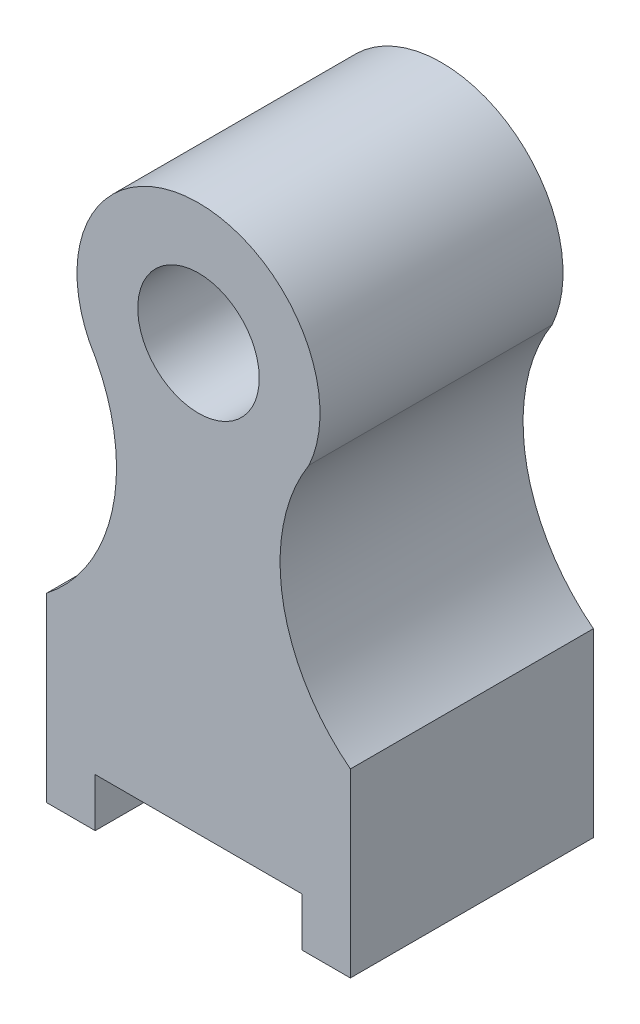
ISO-10303-21;
HEADER;
FILE_DESCRIPTION(('STEP AP214'),'2;1');
FILE_NAME('part.step','',(''),(''),'','','');
FILE_SCHEMA(('AUTOMOTIVE_DESIGN { 1 0 10303 214 1 1 1 1 }'));
ENDSEC;
DATA;
#1=APPLICATION_CONTEXT('core data for automotive mechanical design processes');
#2=APPLICATION_PROTOCOL_DEFINITION('international standard','automotive_design',2000,#1);
#3=PRODUCT_CONTEXT('',#1,'mechanical');
#4=PRODUCT('Part','Part','',(#3));
#5=PRODUCT_RELATED_PRODUCT_CATEGORY('part','',(#4));
#6=PRODUCT_DEFINITION_FORMATION('','',#4);
#7=PRODUCT_DEFINITION_CONTEXT('part definition',#1,'design');
#8=PRODUCT_DEFINITION('design','',#6,#7);
#9=PRODUCT_DEFINITION_SHAPE('','',#8);
#10=(LENGTH_UNIT() NAMED_UNIT(*) SI_UNIT(.MILLI.,.METRE.));
#11=(NAMED_UNIT(*) PLANE_ANGLE_UNIT() SI_UNIT($,.RADIAN.));
#12=(NAMED_UNIT(*) SI_UNIT($,.STERADIAN.) SOLID_ANGLE_UNIT());
#13=UNCERTAINTY_MEASURE_WITH_UNIT(LENGTH_MEASURE(1.E-05),#10,'distance_accuracy_value','');
#14=(GEOMETRIC_REPRESENTATION_CONTEXT(3) GLOBAL_UNCERTAINTY_ASSIGNED_CONTEXT((#13)) GLOBAL_UNIT_ASSIGNED_CONTEXT((#10,
#11,#12)) REPRESENTATION_CONTEXT('',''));
#15=CARTESIAN_POINT('',(0.,0.,0.));
#16=DIRECTION('',(0.,0.,1.));
#17=DIRECTION('',(1.,0.,0.));
#18=AXIS2_PLACEMENT_3D('',#15,#16,#17);
#19=CARTESIAN_POINT('',(110.301443406336,-62.3017088290662,101.6));
#20=DIRECTION('',(0.,0.,-1.));
#21=DIRECTION('',(-1.,0.,0.));
#22=AXIS2_PLACEMENT_3D('',#19,#20,#21);
#23=CYLINDRICAL_SURFACE('',#22,76.2);
#24=CARTESIAN_POINT('',(110.301443406336,-62.3017088290662,0.));
#25=DIRECTION('',(0.,0.,1.));
#26=DIRECTION('',(1.,0.,0.));
#27=AXIS2_PLACEMENT_3D('',#24,#25,#26);
#28=CIRCLE('',#27,76.2);
#29=CARTESIAN_POINT('',(46.2341981913121,-21.0484896751873,0.));
#30=VERTEX_POINT('',#29);
#31=CARTESIAN_POINT('',(63.5,-122.43543393473,0.));
#32=VERTEX_POINT('',#31);
#33=EDGE_CURVE('E146',#30,#32,#28,.T.);
#34=ORIENTED_EDGE('',*,*,#33,.F.);
#35=DIRECTION('',(0.,0.,-1.));
#36=VECTOR('',#35,1.);
#37=CARTESIAN_POINT('',(46.2341981913121,-21.0484896751873,101.6));
#38=LINE('',#37,#36);
#39=CARTESIAN_POINT('',(46.2341981913121,-21.0484896751873,101.6));
#40=VERTEX_POINT('',#39);
#41=EDGE_CURVE('E11',#40,#30,#38,.T.);
#42=ORIENTED_EDGE('',*,*,#41,.F.);
#43=CARTESIAN_POINT('',(110.301443406336,-62.3017088290662,101.6));
#44=DIRECTION('',(0.,0.,1.));
#45=DIRECTION('',(1.,0.,0.));
#46=AXIS2_PLACEMENT_3D('',#43,#44,#45);
#47=CIRCLE('',#46,76.2);
#48=CARTESIAN_POINT('',(63.5,-122.43543393473,101.6));
#49=VERTEX_POINT('',#48);
#50=EDGE_CURVE('E172',#40,#49,#47,.T.);
#51=ORIENTED_EDGE('',*,*,#50,.T.);
#52=DIRECTION('',(0.,0.,-1.));
#53=VECTOR('',#52,1.);
#54=CARTESIAN_POINT('',(63.5,-122.43543393473,101.6));
#55=LINE('',#54,#53);
#56=EDGE_CURVE('E51',#49,#32,#55,.T.);
#57=ORIENTED_EDGE('',*,*,#56,.T.);
#58=EDGE_LOOP('',(#34,#42,#51,#57));
#59=FACE_BOUND('',#58,.T.);
#60=ADVANCED_FACE('F35',(#59),#23,.F.);
#61=CARTESIAN_POINT('',(0.,0.,101.6));
#62=DIRECTION('',(0.,0.,-1.));
#63=DIRECTION('',(-1.,0.,0.));
#64=AXIS2_PLACEMENT_3D('',#61,#62,#63);
#65=CYLINDRICAL_SURFACE('',#64,50.8);
#66=CARTESIAN_POINT('',(0.,0.,0.));
#67=DIRECTION('',(0.,0.,1.));
#68=DIRECTION('',(1.,0.,0.));
#69=AXIS2_PLACEMENT_3D('',#66,#67,#68);
#70=CIRCLE('',#69,50.8);
#71=CARTESIAN_POINT('',(-45.7152952452109,-22.1529181067235,0.));
#72=VERTEX_POINT('',#71);
#73=EDGE_CURVE('E148',#30,#72,#70,.T.);
#74=ORIENTED_EDGE('',*,*,#73,.T.);
#75=DIRECTION('',(0.,0.,-1.));
#76=VECTOR('',#75,1.);
#77=CARTESIAN_POINT('',(-45.7152952452109,-22.1529181067235,101.6));
#78=LINE('',#77,#76);
#79=CARTESIAN_POINT('',(-45.7152952452109,-22.1529181067235,101.6));
#80=VERTEX_POINT('',#79);
#81=EDGE_CURVE('E43',#80,#72,#78,.T.);
#82=ORIENTED_EDGE('',*,*,#81,.F.);
#83=CARTESIAN_POINT('',(0.,0.,101.6));
#84=DIRECTION('',(0.,0.,1.));
#85=DIRECTION('',(1.,0.,0.));
#86=AXIS2_PLACEMENT_3D('',#83,#84,#85);
#87=CIRCLE('',#86,50.8);
#88=EDGE_CURVE('E217',#40,#80,#87,.T.);
#89=ORIENTED_EDGE('',*,*,#88,.F.);
#90=ORIENTED_EDGE('',*,*,#41,.T.);
#91=EDGE_LOOP('',(#74,#82,#89,#90));
#92=FACE_BOUND('',#91,.T.);
#93=ADVANCED_FACE('F195',(#92),#65,.T.);
#94=CARTESIAN_POINT('',(-110.480367649506,-62.3017088290662,101.6));
#95=DIRECTION('',(0.,0.,-1.));
#96=DIRECTION('',(-1.,0.,0.));
#97=AXIS2_PLACEMENT_3D('',#94,#95,#96);
#98=CYLINDRICAL_SURFACE('',#97,76.2);
#99=CARTESIAN_POINT('',(-110.480367649506,-62.3017088290662,0.));
#100=DIRECTION('',(0.,0.,1.));
#101=DIRECTION('',(1.,0.,0.));
#102=AXIS2_PLACEMENT_3D('',#99,#100,#101);
#103=CIRCLE('',#102,76.2);
#104=CARTESIAN_POINT('',(-63.5,-122.295750662546,0.));
#105=VERTEX_POINT('',#104);
#106=EDGE_CURVE('E151',#105,#72,#103,.T.);
#107=ORIENTED_EDGE('',*,*,#106,.F.);
#108=DIRECTION('',(0.,0.,-1.));
#109=VECTOR('',#108,1.);
#110=CARTESIAN_POINT('',(-63.5,-122.295750662546,101.6));
#111=LINE('',#110,#109);
#112=CARTESIAN_POINT('',(-63.5,-122.295750662546,101.6));
#113=VERTEX_POINT('',#112);
#114=EDGE_CURVE('E185',#113,#105,#111,.T.);
#115=ORIENTED_EDGE('',*,*,#114,.F.);
#116=CARTESIAN_POINT('',(-110.480367649506,-62.3017088290662,101.6));
#117=DIRECTION('',(0.,0.,1.));
#118=DIRECTION('',(1.,0.,0.));
#119=AXIS2_PLACEMENT_3D('',#116,#117,#118);
#120=CIRCLE('',#119,76.2);
#121=EDGE_CURVE('E192',#113,#80,#120,.T.);
#122=ORIENTED_EDGE('',*,*,#121,.T.);
#123=ORIENTED_EDGE('',*,*,#81,.T.);
#124=EDGE_LOOP('',(#107,#115,#122,#123));
#125=FACE_BOUND('',#124,.T.);
#126=ADVANCED_FACE('F190',(#125),#98,.F.);
#127=CARTESIAN_POINT('',(-63.5,0.,101.6));
#128=DIRECTION('',(1.,0.,0.));
#129=DIRECTION('',(0.,1.,0.));
#130=AXIS2_PLACEMENT_3D('',#127,#128,#129);
#131=PLANE('',#130);
#132=DIRECTION('',(0.,-1.,0.));
#133=VECTOR('',#132,1.);
#134=CARTESIAN_POINT('',(-63.5,0.,0.));
#135=LINE('',#134,#133);
#136=CARTESIAN_POINT('',(-63.5,-198.12,0.));
#137=VERTEX_POINT('',#136);
#138=EDGE_CURVE('E154',#105,#137,#135,.T.);
#139=ORIENTED_EDGE('',*,*,#138,.T.);
#140=DIRECTION('',(0.,0.,-1.));
#141=VECTOR('',#140,1.);
#142=CARTESIAN_POINT('',(-63.5,-198.12,101.6));
#143=LINE('',#142,#141);
#144=CARTESIAN_POINT('',(-63.5,-198.12,101.6));
#145=VERTEX_POINT('',#144);
#146=EDGE_CURVE('E182',#145,#137,#143,.T.);
#147=ORIENTED_EDGE('',*,*,#146,.F.);
#148=DIRECTION('',(0.,-1.,0.));
#149=VECTOR('',#148,1.);
#150=CARTESIAN_POINT('',(-63.5,0.,101.6));
#151=LINE('',#150,#149);
#152=EDGE_CURVE('E212',#113,#145,#151,.T.);
#153=ORIENTED_EDGE('',*,*,#152,.F.);
#154=ORIENTED_EDGE('',*,*,#114,.T.);
#155=EDGE_LOOP('',(#139,#147,#153,#154));
#156=FACE_BOUND('',#155,.T.);
#157=ADVANCED_FACE('F204',(#156),#131,.F.);
#158=CARTESIAN_POINT('',(0.,-198.12,101.6));
#159=DIRECTION('',(0.,1.,0.));
#160=DIRECTION('',(0.,0.,1.));
#161=AXIS2_PLACEMENT_3D('',#158,#159,#160);
#162=PLANE('',#161);
#163=DIRECTION('',(1.,0.,0.));
#164=VECTOR('',#163,1.);
#165=CARTESIAN_POINT('',(0.,-198.12,0.));
#166=LINE('',#165,#164);
#167=CARTESIAN_POINT('',(-43.18,-198.12,0.));
#168=VERTEX_POINT('',#167);
#169=EDGE_CURVE('E156',#137,#168,#166,.T.);
#170=ORIENTED_EDGE('',*,*,#169,.T.);
#171=DIRECTION('',(0.,0.,-1.));
#172=VECTOR('',#171,1.);
#173=CARTESIAN_POINT('',(-43.18,-198.12,101.6));
#174=LINE('',#173,#172);
#175=CARTESIAN_POINT('',(-43.18,-198.12,101.6));
#176=VERTEX_POINT('',#175);
#177=EDGE_CURVE('E179',#176,#168,#174,.T.);
#178=ORIENTED_EDGE('',*,*,#177,.F.);
#179=DIRECTION('',(1.,0.,0.));
#180=VECTOR('',#179,1.);
#181=CARTESIAN_POINT('',(0.,-198.12,101.6));
#182=LINE('',#181,#180);
#183=EDGE_CURVE('E210',#145,#176,#182,.T.);
#184=ORIENTED_EDGE('',*,*,#183,.F.);
#185=ORIENTED_EDGE('',*,*,#146,.T.);
#186=EDGE_LOOP('',(#170,#178,#184,#185));
#187=FACE_BOUND('',#186,.T.);
#188=ADVANCED_FACE('F208',(#187),#162,.F.);
#189=CARTESIAN_POINT('',(-43.18,0.,101.6));
#190=DIRECTION('',(-1.,0.,0.));
#191=DIRECTION('',(0.,0.,1.));
#192=AXIS2_PLACEMENT_3D('',#189,#190,#191);
#193=PLANE('',#192);
#194=DIRECTION('',(0.,1.,0.));
#195=VECTOR('',#194,1.);
#196=CARTESIAN_POINT('',(-43.18,0.,0.));
#197=LINE('',#196,#195);
#198=CARTESIAN_POINT('',(-43.18,-177.8,0.));
#199=VERTEX_POINT('',#198);
#200=EDGE_CURVE('E158',#168,#199,#197,.T.);
#201=ORIENTED_EDGE('',*,*,#200,.T.);
#202=DIRECTION('',(0.,0.,-1.));
#203=VECTOR('',#202,1.);
#204=CARTESIAN_POINT('',(-43.18,-177.8,101.6));
#205=LINE('',#204,#203);
#206=CARTESIAN_POINT('',(-43.18,-177.8,101.6));
#207=VERTEX_POINT('',#206);
#208=EDGE_CURVE('E176',#207,#199,#205,.T.);
#209=ORIENTED_EDGE('',*,*,#208,.F.);
#210=DIRECTION('',(0.,1.,0.));
#211=VECTOR('',#210,1.);
#212=CARTESIAN_POINT('',(-43.18,0.,101.6));
#213=LINE('',#212,#211);
#214=EDGE_CURVE('E138',#176,#207,#213,.T.);
#215=ORIENTED_EDGE('',*,*,#214,.F.);
#216=ORIENTED_EDGE('',*,*,#177,.T.);
#217=EDGE_LOOP('',(#201,#209,#215,#216));
#218=FACE_BOUND('',#217,.T.);
#219=ADVANCED_FACE('F243',(#218),#193,.F.);
#220=CARTESIAN_POINT('',(0.,-177.8,101.6));
#221=DIRECTION('',(0.,1.,0.));
#222=DIRECTION('',(0.,0.,1.));
#223=AXIS2_PLACEMENT_3D('',#220,#221,#222);
#224=PLANE('',#223);
#225=DIRECTION('',(1.,0.,0.));
#226=VECTOR('',#225,1.);
#227=CARTESIAN_POINT('',(0.,-177.8,0.));
#228=LINE('',#227,#226);
#229=CARTESIAN_POINT('',(43.18,-177.8,0.));
#230=VERTEX_POINT('',#229);
#231=EDGE_CURVE('E160',#199,#230,#228,.T.);
#232=ORIENTED_EDGE('',*,*,#231,.T.);
#233=DIRECTION('',(0.,0.,-1.));
#234=VECTOR('',#233,1.);
#235=CARTESIAN_POINT('',(43.18,-177.8,101.6));
#236=LINE('',#235,#234);
#237=CARTESIAN_POINT('',(43.18,-177.8,101.6));
#238=VERTEX_POINT('',#237);
#239=EDGE_CURVE('E123',#238,#230,#236,.T.);
#240=ORIENTED_EDGE('',*,*,#239,.F.);
#241=DIRECTION('',(1.,0.,0.));
#242=VECTOR('',#241,1.);
#243=CARTESIAN_POINT('',(0.,-177.8,101.6));
#244=LINE('',#243,#242);
#245=EDGE_CURVE('E135',#207,#238,#244,.T.);
#246=ORIENTED_EDGE('',*,*,#245,.F.);
#247=ORIENTED_EDGE('',*,*,#208,.T.);
#248=EDGE_LOOP('',(#232,#240,#246,#247));
#249=FACE_BOUND('',#248,.T.);
#250=ADVANCED_FACE('F246',(#249),#224,.F.);
#251=CARTESIAN_POINT('',(43.18,0.,101.6));
#252=DIRECTION('',(-1.,0.,0.));
#253=DIRECTION('',(0.,0.,1.));
#254=AXIS2_PLACEMENT_3D('',#251,#252,#253);
#255=PLANE('',#254);
#256=DIRECTION('',(0.,1.,0.));
#257=VECTOR('',#256,1.);
#258=CARTESIAN_POINT('',(43.18,0.,0.));
#259=LINE('',#258,#257);
#260=CARTESIAN_POINT('',(43.18,-198.12,0.));
#261=VERTEX_POINT('',#260);
#262=EDGE_CURVE('E120',#261,#230,#259,.T.);
#263=ORIENTED_EDGE('',*,*,#262,.F.);
#264=DIRECTION('',(0.,0.,-1.));
#265=VECTOR('',#264,1.);
#266=CARTESIAN_POINT('',(43.18,-198.12,101.6));
#267=LINE('',#266,#265);
#268=CARTESIAN_POINT('',(43.18,-198.12,101.6));
#269=VERTEX_POINT('',#268);
#270=EDGE_CURVE('E114',#269,#261,#267,.T.);
#271=ORIENTED_EDGE('',*,*,#270,.F.);
#272=DIRECTION('',(0.,1.,0.));
#273=VECTOR('',#272,1.);
#274=CARTESIAN_POINT('',(43.18,0.,101.6));
#275=LINE('',#274,#273);
#276=EDGE_CURVE('E118',#269,#238,#275,.T.);
#277=ORIENTED_EDGE('',*,*,#276,.T.);
#278=ORIENTED_EDGE('',*,*,#239,.T.);
#279=EDGE_LOOP('',(#263,#271,#277,#278));
#280=FACE_BOUND('',#279,.T.);
#281=ADVANCED_FACE('F116',(#280),#255,.T.);
#282=CARTESIAN_POINT('',(0.,-198.12,101.6));
#283=DIRECTION('',(0.,1.,0.));
#284=DIRECTION('',(0.,0.,1.));
#285=AXIS2_PLACEMENT_3D('',#282,#283,#284);
#286=PLANE('',#285);
#287=DIRECTION('',(1.,0.,0.));
#288=VECTOR('',#287,1.);
#289=CARTESIAN_POINT('',(0.,-198.12,0.));
#290=LINE('',#289,#288);
#291=CARTESIAN_POINT('',(63.5,-198.12,0.));
#292=VERTEX_POINT('',#291);
#293=EDGE_CURVE('E164',#261,#292,#290,.T.);
#294=ORIENTED_EDGE('',*,*,#293,.T.);
#295=DIRECTION('',(0.,0.,-1.));
#296=VECTOR('',#295,1.);
#297=CARTESIAN_POINT('',(63.5,-198.12,101.6));
#298=LINE('',#297,#296);
#299=CARTESIAN_POINT('',(63.5,-198.12,101.6));
#300=VERTEX_POINT('',#299);
#301=EDGE_CURVE('E83',#300,#292,#298,.T.);
#302=ORIENTED_EDGE('',*,*,#301,.F.);
#303=DIRECTION('',(1.,0.,0.));
#304=VECTOR('',#303,1.);
#305=CARTESIAN_POINT('',(0.,-198.12,101.6));
#306=LINE('',#305,#304);
#307=EDGE_CURVE('E125',#269,#300,#306,.T.);
#308=ORIENTED_EDGE('',*,*,#307,.F.);
#309=ORIENTED_EDGE('',*,*,#270,.T.);
#310=EDGE_LOOP('',(#294,#302,#308,#309));
#311=FACE_BOUND('',#310,.T.);
#312=ADVANCED_FACE('F126',(#311),#286,.F.);
#313=CARTESIAN_POINT('',(63.4999999999999,0.,101.6));
#314=DIRECTION('',(1.,0.,0.));
#315=DIRECTION('',(0.,1.,0.));
#316=AXIS2_PLACEMENT_3D('',#313,#314,#315);
#317=PLANE('',#316);
#318=DIRECTION('',(0.,-1.,0.));
#319=VECTOR('',#318,1.);
#320=CARTESIAN_POINT('',(63.4999999999999,0.,0.));
#321=LINE('',#320,#319);
#322=EDGE_CURVE('E166',#32,#292,#321,.T.);
#323=ORIENTED_EDGE('',*,*,#322,.F.);
#324=ORIENTED_EDGE('',*,*,#56,.F.);
#325=DIRECTION('',(0.,-1.,0.));
#326=VECTOR('',#325,1.);
#327=CARTESIAN_POINT('',(63.4999999999999,0.,101.6));
#328=LINE('',#327,#326);
#329=EDGE_CURVE('E129',#49,#300,#328,.T.);
#330=ORIENTED_EDGE('',*,*,#329,.T.);
#331=ORIENTED_EDGE('',*,*,#301,.T.);
#332=EDGE_LOOP('',(#323,#324,#330,#331));
#333=FACE_BOUND('',#332,.T.);
#334=ADVANCED_FACE('F219',(#333),#317,.T.);
#335=CARTESIAN_POINT('',(0.,0.,101.6));
#336=DIRECTION('',(0.,0.,-1.));
#337=DIRECTION('',(-1.,0.,0.));
#338=AXIS2_PLACEMENT_3D('',#335,#336,#337);
#339=CYLINDRICAL_SURFACE('',#338,25.4);
#340=CARTESIAN_POINT('',(0.,0.,101.6));
#341=DIRECTION('',(0.,0.,1.));
#342=DIRECTION('',(1.,0.,0.));
#343=AXIS2_PLACEMENT_3D('',#340,#341,#342);
#344=CIRCLE('',#343,25.4);
#345=CARTESIAN_POINT('',(25.4,0.,101.6));
#346=VERTEX_POINT('',#345);
#347=EDGE_CURVE('E143',#346,#346,#344,.T.);
#348=ORIENTED_EDGE('',*,*,#347,.T.);
#349=EDGE_LOOP('',(#348));
#350=FACE_BOUND('',#349,.T.);
#351=CARTESIAN_POINT('',(0.,0.,0.));
#352=DIRECTION('',(0.,0.,1.));
#353=DIRECTION('',(1.,0.,0.));
#354=AXIS2_PLACEMENT_3D('',#351,#352,#353);
#355=CIRCLE('',#354,25.4);
#356=CARTESIAN_POINT('',(25.4,0.,0.));
#357=VERTEX_POINT('',#356);
#358=EDGE_CURVE('E169',#357,#357,#355,.T.);
#359=ORIENTED_EDGE('',*,*,#358,.F.);
#360=EDGE_LOOP('',(#359));
#361=FACE_BOUND('',#360,.T.);
#362=ADVANCED_FACE('F221',(#350,#361),#339,.F.);
#363=CARTESIAN_POINT('',(0.,0.,101.6));
#364=DIRECTION('',(0.,0.,1.));
#365=DIRECTION('',(1.,0.,0.));
#366=AXIS2_PLACEMENT_3D('',#363,#364,#365);
#367=PLANE('',#366);
#368=ORIENTED_EDGE('',*,*,#50,.F.);
#369=ORIENTED_EDGE('',*,*,#88,.T.);
#370=ORIENTED_EDGE('',*,*,#121,.F.);
#371=ORIENTED_EDGE('',*,*,#152,.T.);
#372=ORIENTED_EDGE('',*,*,#183,.T.);
#373=ORIENTED_EDGE('',*,*,#214,.T.);
#374=ORIENTED_EDGE('',*,*,#245,.T.);
#375=ORIENTED_EDGE('',*,*,#276,.F.);
#376=ORIENTED_EDGE('',*,*,#307,.T.);
#377=ORIENTED_EDGE('',*,*,#329,.F.);
#378=EDGE_LOOP('',(#368,#369,#370,#371,#372,#373,#374,#375,#376,#377));
#379=FACE_BOUND('',#378,.T.);
#380=ORIENTED_EDGE('',*,*,#347,.F.);
#381=EDGE_LOOP('',(#380));
#382=FACE_BOUND('',#381,.T.);
#383=ADVANCED_FACE('F132',(#379,#382),#367,.T.);
#384=CARTESIAN_POINT('',(0.,0.,0.));
#385=DIRECTION('',(0.,0.,1.));
#386=DIRECTION('',(1.,0.,0.));
#387=AXIS2_PLACEMENT_3D('',#384,#385,#386);
#388=PLANE('',#387);
#389=ORIENTED_EDGE('',*,*,#33,.T.);
#390=ORIENTED_EDGE('',*,*,#322,.T.);
#391=ORIENTED_EDGE('',*,*,#293,.F.);
#392=ORIENTED_EDGE('',*,*,#262,.T.);
#393=ORIENTED_EDGE('',*,*,#231,.F.);
#394=ORIENTED_EDGE('',*,*,#200,.F.);
#395=ORIENTED_EDGE('',*,*,#169,.F.);
#396=ORIENTED_EDGE('',*,*,#138,.F.);
#397=ORIENTED_EDGE('',*,*,#106,.T.);
#398=ORIENTED_EDGE('',*,*,#73,.F.);
#399=EDGE_LOOP('',(#389,#390,#391,#392,#393,#394,#395,#396,#397,#398));
#400=FACE_BOUND('',#399,.T.);
#401=ORIENTED_EDGE('',*,*,#358,.T.);
#402=EDGE_LOOP('',(#401));
#403=FACE_BOUND('',#402,.T.);
#404=ADVANCED_FACE('F198',(#400,#403),#388,.F.);
#405=CLOSED_SHELL('',(#60,#93,#126,#157,#188,#219,#250,#281,#312,#334,#362,#383,#404));
#406=MANIFOLD_SOLID_BREP('B2',#405);
#407=ADVANCED_BREP_SHAPE_REPRESENTATION('',(#18,#406),#14);
#408=SHAPE_DEFINITION_REPRESENTATION(#9,#407);
ENDSEC;
END-ISO-10303-21;
